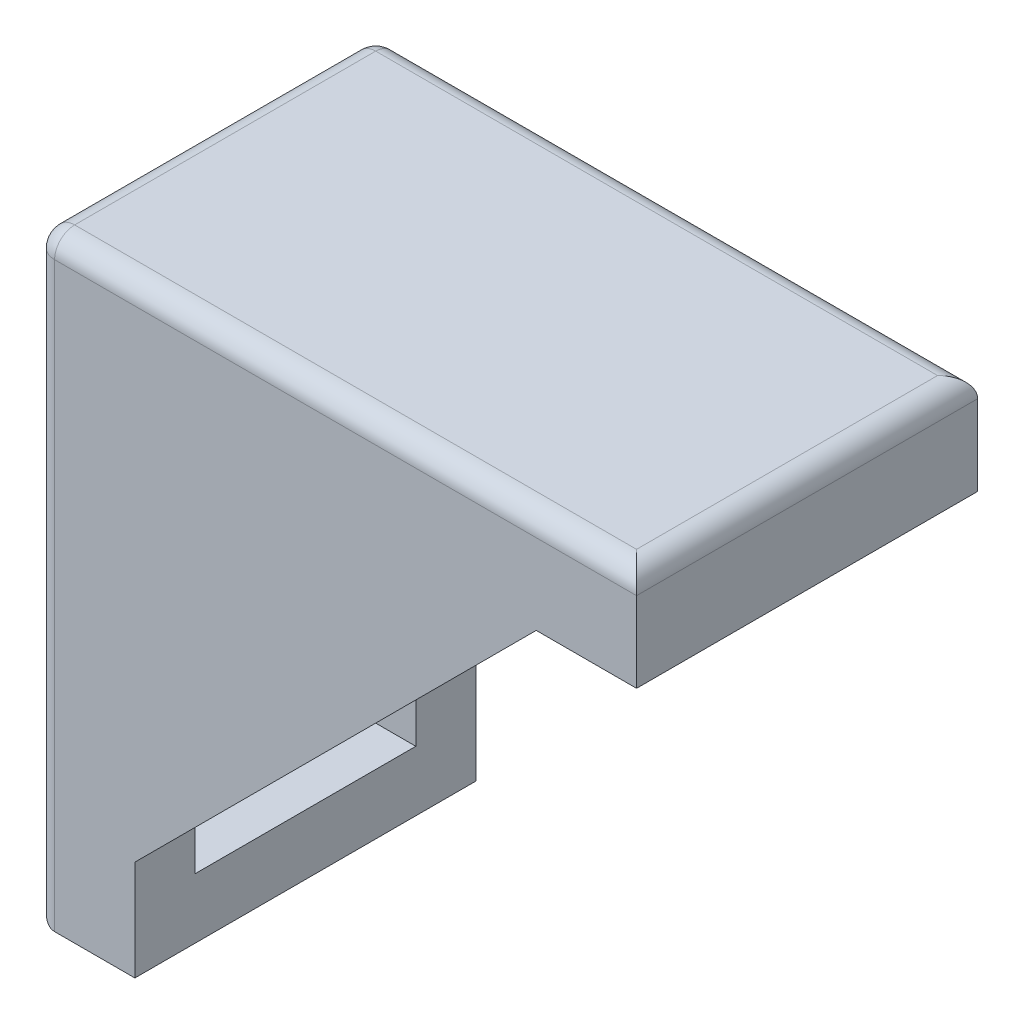
ISO-10303-21;
HEADER;
FILE_DESCRIPTION(('STEP AP214'),'2;1');
FILE_NAME('part.step','',(''),(''),'','','');
FILE_SCHEMA(('AUTOMOTIVE_DESIGN { 1 0 10303 214 1 1 1 1 }'));
ENDSEC;
DATA;
#1=APPLICATION_CONTEXT('core data for automotive mechanical design processes');
#2=APPLICATION_PROTOCOL_DEFINITION('international standard','automotive_design',2000,#1);
#3=PRODUCT_CONTEXT('',#1,'mechanical');
#4=PRODUCT('Part','Part','',(#3));
#5=PRODUCT_RELATED_PRODUCT_CATEGORY('part','',(#4));
#6=PRODUCT_DEFINITION_FORMATION('','',#4);
#7=PRODUCT_DEFINITION_CONTEXT('part definition',#1,'design');
#8=PRODUCT_DEFINITION('design','',#6,#7);
#9=PRODUCT_DEFINITION_SHAPE('','',#8);
#10=(LENGTH_UNIT() NAMED_UNIT(*) SI_UNIT(.MILLI.,.METRE.));
#11=(NAMED_UNIT(*) PLANE_ANGLE_UNIT() SI_UNIT($,.RADIAN.));
#12=(NAMED_UNIT(*) SI_UNIT($,.STERADIAN.) SOLID_ANGLE_UNIT());
#13=UNCERTAINTY_MEASURE_WITH_UNIT(LENGTH_MEASURE(1.E-05),#10,'distance_accuracy_value','');
#14=(GEOMETRIC_REPRESENTATION_CONTEXT(3) GLOBAL_UNCERTAINTY_ASSIGNED_CONTEXT((#13)) GLOBAL_UNIT_ASSIGNED_CONTEXT((#10,
#11,#12)) REPRESENTATION_CONTEXT('',''));
#15=CARTESIAN_POINT('',(0.,0.,0.));
#16=DIRECTION('',(0.,0.,1.));
#17=DIRECTION('',(1.,0.,0.));
#18=AXIS2_PLACEMENT_3D('',#15,#16,#17);
#19=CARTESIAN_POINT('',(30.,-5.,-17.));
#20=DIRECTION('',(0.,-1.,0.));
#21=DIRECTION('',(1.,0.,0.));
#22=AXIS2_PLACEMENT_3D('',#19,#20,#21);
#23=PLANE('',#22);
#24=DIRECTION('',(0.,0.,1.));
#25=VECTOR('',#24,1.);
#26=CARTESIAN_POINT('',(25.,-5.,-17.));
#27=LINE('',#26,#25);
#28=CARTESIAN_POINT('',(25.,-5.,-3.));
#29=VERTEX_POINT('',#28);
#30=CARTESIAN_POINT('',(25.,-5.,0.));
#31=VERTEX_POINT('',#30);
#32=EDGE_CURVE('E266',#29,#31,#27,.T.);
#33=ORIENTED_EDGE('',*,*,#32,.F.);
#34=DIRECTION('',(1.,0.,0.));
#35=VECTOR('',#34,1.);
#36=CARTESIAN_POINT('',(30.,-5.,-3.));
#37=LINE('',#36,#35);
#38=CARTESIAN_POINT('',(27.,-5.,-3.));
#39=VERTEX_POINT('',#38);
#40=EDGE_CURVE('E199',#29,#39,#37,.T.);
#41=ORIENTED_EDGE('',*,*,#40,.T.);
#42=DIRECTION('',(0.,0.,1.));
#43=VECTOR('',#42,1.);
#44=CARTESIAN_POINT('',(27.,-5.,-17.));
#45=LINE('',#44,#43);
#46=CARTESIAN_POINT('',(27.,-5.,-14.));
#47=VERTEX_POINT('',#46);
#48=EDGE_CURVE('E184',#47,#39,#45,.T.);
#49=ORIENTED_EDGE('',*,*,#48,.F.);
#50=DIRECTION('',(1.,0.,0.));
#51=VECTOR('',#50,1.);
#52=CARTESIAN_POINT('',(30.,-5.,-14.));
#53=LINE('',#52,#51);
#54=CARTESIAN_POINT('',(25.,-5.,-14.));
#55=VERTEX_POINT('',#54);
#56=EDGE_CURVE('E216',#55,#47,#53,.T.);
#57=ORIENTED_EDGE('',*,*,#56,.F.);
#58=CARTESIAN_POINT('',(25.,-5.,-17.));
#59=VERTEX_POINT('',#58);
#60=EDGE_CURVE('E262',#59,#55,#27,.T.);
#61=ORIENTED_EDGE('',*,*,#60,.F.);
#62=DIRECTION('',(1.,0.,0.));
#63=VECTOR('',#62,1.);
#64=CARTESIAN_POINT('',(30.,-5.,-17.));
#65=LINE('',#64,#63);
#66=CARTESIAN_POINT('',(30.,-5.,-17.));
#67=VERTEX_POINT('',#66);
#68=EDGE_CURVE('E232',#59,#67,#65,.T.);
#69=ORIENTED_EDGE('',*,*,#68,.T.);
#70=DIRECTION('',(0.,0.,1.));
#71=VECTOR('',#70,1.);
#72=CARTESIAN_POINT('',(30.,-5.,-17.));
#73=LINE('',#72,#71);
#74=CARTESIAN_POINT('',(30.,-5.,0.));
#75=VERTEX_POINT('',#74);
#76=EDGE_CURVE('E258',#67,#75,#73,.T.);
#77=ORIENTED_EDGE('',*,*,#76,.T.);
#78=DIRECTION('',(1.,0.,0.));
#79=VECTOR('',#78,1.);
#80=CARTESIAN_POINT('',(30.,-5.,0.));
#81=LINE('',#80,#79);
#82=EDGE_CURVE('E252',#31,#75,#81,.T.);
#83=ORIENTED_EDGE('',*,*,#82,.F.);
#84=EDGE_LOOP('',(#33,#41,#49,#57,#61,#69,#77,#83));
#85=FACE_BOUND('',#84,.T.);
#86=ADVANCED_FACE('F39',(#85),#23,.T.);
#87=CARTESIAN_POINT('',(25.,-5.,-17.));
#88=DIRECTION('',(0.707106781186547,-0.707106781186547,0.));
#89=DIRECTION('',(0.707106781186548,0.707106781186548,0.));
#90=AXIS2_PLACEMENT_3D('',#87,#88,#89);
#91=PLANE('',#90);
#92=DIRECTION('',(0.,0.,1.));
#93=VECTOR('',#92,1.);
#94=CARTESIAN_POINT('',(5.,-25.,-17.));
#95=LINE('',#94,#93);
#96=CARTESIAN_POINT('',(5.,-25.,-3.));
#97=VERTEX_POINT('',#96);
#98=CARTESIAN_POINT('',(5.,-25.,0.));
#99=VERTEX_POINT('',#98);
#100=EDGE_CURVE('E271',#97,#99,#95,.T.);
#101=ORIENTED_EDGE('',*,*,#100,.F.);
#102=DIRECTION('',(0.707106781186548,0.707106781186548,0.));
#103=VECTOR('',#102,1.);
#104=CARTESIAN_POINT('',(25.,-5.,-3.));
#105=LINE('',#104,#103);
#106=EDGE_CURVE('E192',#97,#29,#105,.T.);
#107=ORIENTED_EDGE('',*,*,#106,.T.);
#108=ORIENTED_EDGE('',*,*,#32,.T.);
#109=DIRECTION('',(0.707106781186548,0.707106781186548,0.));
#110=VECTOR('',#109,1.);
#111=CARTESIAN_POINT('',(25.,-5.,0.));
#112=LINE('',#111,#110);
#113=EDGE_CURVE('E248',#99,#31,#112,.T.);
#114=ORIENTED_EDGE('',*,*,#113,.F.);
#115=EDGE_LOOP('',(#101,#107,#108,#114));
#116=FACE_BOUND('',#115,.T.);
#117=ADVANCED_FACE('F418',(#116),#91,.T.);
#118=CARTESIAN_POINT('',(5.,-25.,-17.));
#119=DIRECTION('',(1.,0.,0.));
#120=DIRECTION('',(0.,1.,0.));
#121=AXIS2_PLACEMENT_3D('',#118,#119,#120);
#122=PLANE('',#121);
#123=DIRECTION('',(0.,0.,1.));
#124=VECTOR('',#123,1.);
#125=CARTESIAN_POINT('',(5.,-27.,-17.));
#126=LINE('',#125,#124);
#127=CARTESIAN_POINT('',(5.,-27.,-14.));
#128=VERTEX_POINT('',#127);
#129=CARTESIAN_POINT('',(5.,-27.,-3.));
#130=VERTEX_POINT('',#129);
#131=EDGE_CURVE('E57',#128,#130,#126,.T.);
#132=ORIENTED_EDGE('',*,*,#131,.T.);
#133=DIRECTION('',(0.,1.,0.));
#134=VECTOR('',#133,1.);
#135=CARTESIAN_POINT('',(5.,-25.,-3.));
#136=LINE('',#135,#134);
#137=EDGE_CURVE('E188',#130,#97,#136,.T.);
#138=ORIENTED_EDGE('',*,*,#137,.T.);
#139=ORIENTED_EDGE('',*,*,#100,.T.);
#140=DIRECTION('',(0.,1.,0.));
#141=VECTOR('',#140,1.);
#142=CARTESIAN_POINT('',(5.,-25.,0.));
#143=LINE('',#142,#141);
#144=CARTESIAN_POINT('',(5.,-30.,0.));
#145=VERTEX_POINT('',#144);
#146=EDGE_CURVE('E244',#145,#99,#143,.T.);
#147=ORIENTED_EDGE('',*,*,#146,.F.);
#148=DIRECTION('',(0.,0.,1.));
#149=VECTOR('',#148,1.);
#150=CARTESIAN_POINT('',(5.,-30.,-17.));
#151=LINE('',#150,#149);
#152=CARTESIAN_POINT('',(5.,-30.,-17.));
#153=VERTEX_POINT('',#152);
#154=EDGE_CURVE('E240',#153,#145,#151,.T.);
#155=ORIENTED_EDGE('',*,*,#154,.F.);
#156=DIRECTION('',(0.,1.,0.));
#157=VECTOR('',#156,1.);
#158=CARTESIAN_POINT('',(5.,-25.,-17.));
#159=LINE('',#158,#157);
#160=CARTESIAN_POINT('',(5.,-25.,-17.));
#161=VERTEX_POINT('',#160);
#162=EDGE_CURVE('E223',#153,#161,#159,.T.);
#163=ORIENTED_EDGE('',*,*,#162,.T.);
#164=CARTESIAN_POINT('',(5.,-25.,-14.));
#165=VERTEX_POINT('',#164);
#166=EDGE_CURVE('E267',#161,#165,#95,.T.);
#167=ORIENTED_EDGE('',*,*,#166,.T.);
#168=DIRECTION('',(0.,1.,0.));
#169=VECTOR('',#168,1.);
#170=CARTESIAN_POINT('',(5.,-25.,-14.));
#171=LINE('',#170,#169);
#172=EDGE_CURVE('E210',#128,#165,#171,.T.);
#173=ORIENTED_EDGE('',*,*,#172,.F.);
#174=EDGE_LOOP('',(#132,#138,#139,#147,#155,#163,#167,#173));
#175=FACE_BOUND('',#174,.T.);
#176=ADVANCED_FACE('F423',(#175),#122,.T.);
#177=CARTESIAN_POINT('',(0.,-30.,-17.));
#178=DIRECTION('',(-1.,0.,0.));
#179=DIRECTION('',(0.,0.,1.));
#180=AXIS2_PLACEMENT_3D('',#177,#178,#179);
#181=PLANE('',#180);
#182=DIRECTION('',(0.,-1.,0.));
#183=VECTOR('',#182,1.);
#184=CARTESIAN_POINT('',(0.,-30.,-16.));
#185=LINE('',#184,#183);
#186=CARTESIAN_POINT('',(0.,-1.,-16.));
#187=VERTEX_POINT('',#186);
#188=CARTESIAN_POINT('',(0.,-29.,-16.));
#189=VERTEX_POINT('',#188);
#190=EDGE_CURVE('E280',#187,#189,#185,.T.);
#191=ORIENTED_EDGE('',*,*,#190,.T.);
#192=DIRECTION('',(0.,0.,1.));
#193=VECTOR('',#192,1.);
#194=CARTESIAN_POINT('',(0.,-29.,-17.));
#195=LINE('',#194,#193);
#196=CARTESIAN_POINT('',(0.,-29.,-1.));
#197=VERTEX_POINT('',#196);
#198=EDGE_CURVE('E283',#189,#197,#195,.T.);
#199=ORIENTED_EDGE('',*,*,#198,.T.);
#200=DIRECTION('',(0.,-1.,0.));
#201=VECTOR('',#200,1.);
#202=CARTESIAN_POINT('',(0.,0.,-1.));
#203=LINE('',#202,#201);
#204=CARTESIAN_POINT('',(0.,-1.,-1.));
#205=VERTEX_POINT('',#204);
#206=EDGE_CURVE('E261',#197,#205,#203,.F.);
#207=ORIENTED_EDGE('',*,*,#206,.T.);
#208=DIRECTION('',(0.,0.,1.));
#209=VECTOR('',#208,1.);
#210=CARTESIAN_POINT('',(0.,-1.,-17.));
#211=LINE('',#210,#209);
#212=EDGE_CURVE('E277',#205,#187,#211,.F.);
#213=ORIENTED_EDGE('',*,*,#212,.T.);
#214=EDGE_LOOP('',(#191,#199,#207,#213));
#215=FACE_BOUND('',#214,.T.);
#216=ADVANCED_FACE('F398',(#215),#181,.T.);
#217=CARTESIAN_POINT('',(0.,0.,-17.));
#218=DIRECTION('',(0.,1.,0.));
#219=DIRECTION('',(0.,0.,1.));
#220=AXIS2_PLACEMENT_3D('',#217,#218,#219);
#221=PLANE('',#220);
#222=DIRECTION('',(-1.,0.,0.));
#223=VECTOR('',#222,1.);
#224=CARTESIAN_POINT('',(0.,0.,-16.));
#225=LINE('',#224,#223);
#226=CARTESIAN_POINT('',(29.,0.,-16.));
#227=VERTEX_POINT('',#226);
#228=CARTESIAN_POINT('',(1.,0.,-16.));
#229=VERTEX_POINT('',#228);
#230=EDGE_CURVE('E303',#227,#229,#225,.T.);
#231=ORIENTED_EDGE('',*,*,#230,.T.);
#232=DIRECTION('',(0.,0.,1.));
#233=VECTOR('',#232,1.);
#234=CARTESIAN_POINT('',(1.,0.,-17.));
#235=LINE('',#234,#233);
#236=CARTESIAN_POINT('',(1.,0.,-1.));
#237=VERTEX_POINT('',#236);
#238=EDGE_CURVE('E306',#229,#237,#235,.T.);
#239=ORIENTED_EDGE('',*,*,#238,.T.);
#240=DIRECTION('',(-1.,0.,0.));
#241=VECTOR('',#240,1.);
#242=CARTESIAN_POINT('',(30.,0.,-1.));
#243=LINE('',#242,#241);
#244=CARTESIAN_POINT('',(29.,0.,-1.));
#245=VERTEX_POINT('',#244);
#246=EDGE_CURVE('E297',#237,#245,#243,.F.);
#247=ORIENTED_EDGE('',*,*,#246,.T.);
#248=DIRECTION('',(0.,0.,1.));
#249=VECTOR('',#248,1.);
#250=CARTESIAN_POINT('',(29.,0.,-17.));
#251=LINE('',#250,#249);
#252=EDGE_CURVE('E300',#245,#227,#251,.F.);
#253=ORIENTED_EDGE('',*,*,#252,.T.);
#254=EDGE_LOOP('',(#231,#239,#247,#253));
#255=FACE_BOUND('',#254,.T.);
#256=ADVANCED_FACE('F439',(#255),#221,.T.);
#257=CARTESIAN_POINT('',(30.,0.,-17.));
#258=DIRECTION('',(1.,0.,0.));
#259=DIRECTION('',(0.,0.,-1.));
#260=AXIS2_PLACEMENT_3D('',#257,#258,#259);
#261=PLANE('',#260);
#262=DIRECTION('',(0.,1.,0.));
#263=VECTOR('',#262,1.);
#264=CARTESIAN_POINT('',(30.,0.,-17.));
#265=LINE('',#264,#263);
#266=CARTESIAN_POINT('',(30.,-1.,-17.));
#267=VERTEX_POINT('',#266);
#268=EDGE_CURVE('E236',#67,#267,#265,.T.);
#269=ORIENTED_EDGE('',*,*,#268,.T.);
#270=DIRECTION('',(0.,0.,1.));
#271=VECTOR('',#270,1.);
#272=CARTESIAN_POINT('',(30.,-1.,-17.));
#273=LINE('',#272,#271);
#274=CARTESIAN_POINT('',(30.,-1.,0.));
#275=VERTEX_POINT('',#274);
#276=EDGE_CURVE('E310',#267,#275,#273,.T.);
#277=ORIENTED_EDGE('',*,*,#276,.T.);
#278=DIRECTION('',(0.,1.,0.));
#279=VECTOR('',#278,1.);
#280=CARTESIAN_POINT('',(30.,0.,0.));
#281=LINE('',#280,#279);
#282=EDGE_CURVE('E224',#75,#275,#281,.T.);
#283=ORIENTED_EDGE('',*,*,#282,.F.);
#284=ORIENTED_EDGE('',*,*,#76,.F.);
#285=EDGE_LOOP('',(#269,#277,#283,#284));
#286=FACE_BOUND('',#285,.T.);
#287=ADVANCED_FACE('F363',(#286),#261,.T.);
#288=DIRECTION('',(0.707106781186548,0.707106781186548,0.));
#289=VECTOR('',#288,1.);
#290=CARTESIAN_POINT('',(25.,-5.,-14.));
#291=LINE('',#290,#289);
#292=EDGE_CURVE('E213',#165,#55,#291,.T.);
#293=ORIENTED_EDGE('',*,*,#292,.F.);
#294=ORIENTED_EDGE('',*,*,#166,.F.);
#295=DIRECTION('',(0.707106781186548,0.707106781186548,0.));
#296=VECTOR('',#295,1.);
#297=CARTESIAN_POINT('',(25.,-5.,-17.));
#298=LINE('',#297,#296);
#299=EDGE_CURVE('E228',#161,#59,#298,.T.);
#300=ORIENTED_EDGE('',*,*,#299,.T.);
#301=ORIENTED_EDGE('',*,*,#60,.T.);
#302=EDGE_LOOP('',(#293,#294,#300,#301));
#303=FACE_BOUND('',#302,.T.);
#304=ADVANCED_FACE('F426',(#303),#91,.T.);
#305=CARTESIAN_POINT('',(5.,-30.,-17.));
#306=DIRECTION('',(0.,-1.,0.));
#307=DIRECTION('',(0.,0.,-1.));
#308=AXIS2_PLACEMENT_3D('',#305,#306,#307);
#309=PLANE('',#308);
#310=DIRECTION('',(1.,0.,0.));
#311=VECTOR('',#310,1.);
#312=CARTESIAN_POINT('',(5.,-30.,0.));
#313=LINE('',#312,#311);
#314=CARTESIAN_POINT('',(1.,-30.,0.));
#315=VERTEX_POINT('',#314);
#316=EDGE_CURVE('E241',#315,#145,#313,.T.);
#317=ORIENTED_EDGE('',*,*,#316,.F.);
#318=DIRECTION('',(0.,0.,1.));
#319=VECTOR('',#318,1.);
#320=CARTESIAN_POINT('',(1.,-30.,-17.));
#321=LINE('',#320,#319);
#322=CARTESIAN_POINT('',(1.,-30.,-17.));
#323=VERTEX_POINT('',#322);
#324=EDGE_CURVE('E287',#315,#323,#321,.F.);
#325=ORIENTED_EDGE('',*,*,#324,.T.);
#326=DIRECTION('',(1.,0.,0.));
#327=VECTOR('',#326,1.);
#328=CARTESIAN_POINT('',(5.,-30.,-17.));
#329=LINE('',#328,#327);
#330=EDGE_CURVE('E220',#323,#153,#329,.T.);
#331=ORIENTED_EDGE('',*,*,#330,.T.);
#332=ORIENTED_EDGE('',*,*,#154,.T.);
#333=EDGE_LOOP('',(#317,#325,#331,#332));
#334=FACE_BOUND('',#333,.T.);
#335=ADVANCED_FACE('F386',(#334),#309,.T.);
#336=CARTESIAN_POINT('',(0.,0.,-17.));
#337=DIRECTION('',(0.,0.,-1.));
#338=DIRECTION('',(-1.,0.,0.));
#339=AXIS2_PLACEMENT_3D('',#336,#337,#338);
#340=PLANE('',#339);
#341=ORIENTED_EDGE('',*,*,#330,.F.);
#342=DIRECTION('',(0.,-1.,0.));
#343=VECTOR('',#342,1.);
#344=CARTESIAN_POINT('',(1.,0.,-17.));
#345=LINE('',#344,#343);
#346=CARTESIAN_POINT('',(1.,-1.,-17.));
#347=VERTEX_POINT('',#346);
#348=EDGE_CURVE('E294',#323,#347,#345,.F.);
#349=ORIENTED_EDGE('',*,*,#348,.T.);
#350=DIRECTION('',(-1.,0.,0.));
#351=VECTOR('',#350,1.);
#352=CARTESIAN_POINT('',(0.,-1.,-17.));
#353=LINE('',#352,#351);
#354=EDGE_CURVE('E291',#347,#267,#353,.F.);
#355=ORIENTED_EDGE('',*,*,#354,.T.);
#356=ORIENTED_EDGE('',*,*,#268,.F.);
#357=ORIENTED_EDGE('',*,*,#68,.F.);
#358=ORIENTED_EDGE('',*,*,#299,.F.);
#359=ORIENTED_EDGE('',*,*,#162,.F.);
#360=EDGE_LOOP('',(#341,#349,#355,#356,#357,#358,#359));
#361=FACE_BOUND('',#360,.T.);
#362=ADVANCED_FACE('F373',(#361),#340,.T.);
#363=CARTESIAN_POINT('',(0.,0.,0.));
#364=DIRECTION('',(0.,0.,-1.));
#365=DIRECTION('',(-1.,0.,0.));
#366=AXIS2_PLACEMENT_3D('',#363,#364,#365);
#367=PLANE('',#366);
#368=DIRECTION('',(-1.,0.,0.));
#369=VECTOR('',#368,1.);
#370=CARTESIAN_POINT('',(0.,-1.,0.));
#371=LINE('',#370,#369);
#372=CARTESIAN_POINT('',(1.,-1.,0.));
#373=VERTEX_POINT('',#372);
#374=EDGE_CURVE('E49',#275,#373,#371,.T.);
#375=ORIENTED_EDGE('',*,*,#374,.T.);
#376=DIRECTION('',(0.,-1.,0.));
#377=VECTOR('',#376,1.);
#378=CARTESIAN_POINT('',(1.,-30.,0.));
#379=LINE('',#378,#377);
#380=EDGE_CURVE('E11',#373,#315,#379,.T.);
#381=ORIENTED_EDGE('',*,*,#380,.T.);
#382=ORIENTED_EDGE('',*,*,#316,.T.);
#383=ORIENTED_EDGE('',*,*,#146,.T.);
#384=ORIENTED_EDGE('',*,*,#113,.T.);
#385=ORIENTED_EDGE('',*,*,#82,.T.);
#386=ORIENTED_EDGE('',*,*,#282,.T.);
#387=EDGE_LOOP('',(#375,#381,#382,#383,#384,#385,#386));
#388=FACE_BOUND('',#387,.T.);
#389=ADVANCED_FACE('F365',(#388),#367,.F.);
#390=CARTESIAN_POINT('',(29.,-1.,-17.));
#391=DIRECTION('',(0.,0.,1.));
#392=DIRECTION('',(1.,0.,0.));
#393=AXIS2_PLACEMENT_3D('',#390,#391,#392);
#394=CYLINDRICAL_SURFACE('',#393,1.);
#395=CARTESIAN_POINT('',(29.,-1.,-1.));
#396=DIRECTION('',(0.707106781186547,0.,-0.707106781186547));
#397=DIRECTION('',(0.707106781186547,0.,0.707106781186547));
#398=AXIS2_PLACEMENT_3D('',#395,#396,#397);
#399=ELLIPSE('',#398,1.41421356237309,1.);
#400=EDGE_CURVE('E344',#275,#245,#399,.F.);
#401=ORIENTED_EDGE('',*,*,#400,.F.);
#402=ORIENTED_EDGE('',*,*,#276,.F.);
#403=CARTESIAN_POINT('',(29.,-1.,-16.));
#404=DIRECTION('',(0.707106781186547,0.,0.707106781186547));
#405=DIRECTION('',(-0.707106781186547,0.,0.707106781186547));
#406=AXIS2_PLACEMENT_3D('',#403,#404,#405);
#407=ELLIPSE('',#406,1.41421356237309,1.);
#408=EDGE_CURVE('E43',#227,#267,#407,.F.);
#409=ORIENTED_EDGE('',*,*,#408,.F.);
#410=ORIENTED_EDGE('',*,*,#252,.F.);
#411=EDGE_LOOP('',(#401,#402,#409,#410));
#412=FACE_BOUND('',#411,.T.);
#413=ADVANCED_FACE('F41',(#412),#394,.T.);
#414=CARTESIAN_POINT('',(0.,-1.,-16.));
#415=DIRECTION('',(-1.,0.,0.));
#416=DIRECTION('',(0.,0.,1.));
#417=AXIS2_PLACEMENT_3D('',#414,#415,#416);
#418=CYLINDRICAL_SURFACE('',#417,1.);
#419=ORIENTED_EDGE('',*,*,#408,.T.);
#420=ORIENTED_EDGE('',*,*,#354,.F.);
#421=CARTESIAN_POINT('',(1.,-1.,-16.));
#422=DIRECTION('',(-1.,0.,0.));
#423=DIRECTION('',(0.,0.,1.));
#424=AXIS2_PLACEMENT_3D('',#421,#422,#423);
#425=CIRCLE('',#424,1.);
#426=EDGE_CURVE('E341',#229,#347,#425,.T.);
#427=ORIENTED_EDGE('',*,*,#426,.F.);
#428=ORIENTED_EDGE('',*,*,#230,.F.);
#429=EDGE_LOOP('',(#419,#420,#427,#428));
#430=FACE_BOUND('',#429,.T.);
#431=ADVANCED_FACE('F356',(#430),#418,.T.);
#432=CARTESIAN_POINT('',(1.,-1.,-17.));
#433=DIRECTION('',(0.,0.,1.));
#434=DIRECTION('',(1.,0.,0.));
#435=AXIS2_PLACEMENT_3D('',#432,#433,#434);
#436=CYLINDRICAL_SURFACE('',#435,1.);
#437=CARTESIAN_POINT('',(1.,-1.,-1.));
#438=DIRECTION('',(0.,0.,1.));
#439=DIRECTION('',(1.,0.,0.));
#440=AXIS2_PLACEMENT_3D('',#437,#438,#439);
#441=CIRCLE('',#440,1.);
#442=EDGE_CURVE('E333',#237,#205,#441,.T.);
#443=ORIENTED_EDGE('',*,*,#442,.F.);
#444=ORIENTED_EDGE('',*,*,#238,.F.);
#445=CARTESIAN_POINT('',(1.,-1.,-16.));
#446=DIRECTION('',(0.,0.,-1.));
#447=DIRECTION('',(-1.,0.,0.));
#448=AXIS2_PLACEMENT_3D('',#445,#446,#447);
#449=CIRCLE('',#448,1.);
#450=EDGE_CURVE('E337',#187,#229,#449,.T.);
#451=ORIENTED_EDGE('',*,*,#450,.F.);
#452=ORIENTED_EDGE('',*,*,#212,.F.);
#453=EDGE_LOOP('',(#443,#444,#451,#452));
#454=FACE_BOUND('',#453,.T.);
#455=ADVANCED_FACE('F403',(#454),#436,.T.);
#456=CARTESIAN_POINT('',(0.,-1.,-1.));
#457=DIRECTION('',(1.,0.,0.));
#458=DIRECTION('',(0.,0.,-1.));
#459=AXIS2_PLACEMENT_3D('',#456,#457,#458);
#460=CYLINDRICAL_SURFACE('',#459,1.);
#461=ORIENTED_EDGE('',*,*,#400,.T.);
#462=ORIENTED_EDGE('',*,*,#246,.F.);
#463=CARTESIAN_POINT('',(1.,-1.,-1.));
#464=DIRECTION('',(-1.,0.,0.));
#465=DIRECTION('',(0.,0.,1.));
#466=AXIS2_PLACEMENT_3D('',#463,#464,#465);
#467=CIRCLE('',#466,1.);
#468=EDGE_CURVE('E330',#373,#237,#467,.T.);
#469=ORIENTED_EDGE('',*,*,#468,.F.);
#470=ORIENTED_EDGE('',*,*,#374,.F.);
#471=EDGE_LOOP('',(#461,#462,#469,#470));
#472=FACE_BOUND('',#471,.T.);
#473=ADVANCED_FACE('F408',(#472),#460,.T.);
#474=CARTESIAN_POINT('',(1.,-1.,-16.));
#475=DIRECTION('',(0.,0.,1.));
#476=DIRECTION('',(1.,0.,0.));
#477=AXIS2_PLACEMENT_3D('',#474,#475,#476);
#478=SPHERICAL_SURFACE('',#477,1.);
#479=ORIENTED_EDGE('',*,*,#450,.T.);
#480=ORIENTED_EDGE('',*,*,#426,.T.);
#481=CARTESIAN_POINT('',(1.,-1.,-16.));
#482=DIRECTION('',(0.,1.,0.));
#483=DIRECTION('',(0.,0.,1.));
#484=AXIS2_PLACEMENT_3D('',#481,#482,#483);
#485=CIRCLE('',#484,1.);
#486=EDGE_CURVE('E326',#187,#347,#485,.F.);
#487=ORIENTED_EDGE('',*,*,#486,.F.);
#488=EDGE_LOOP('',(#479,#480,#487));
#489=FACE_BOUND('',#488,.T.);
#490=ADVANCED_FACE('F405',(#489),#478,.T.);
#491=CARTESIAN_POINT('',(1.,-1.,-1.));
#492=DIRECTION('',(0.,0.,1.));
#493=DIRECTION('',(1.,0.,0.));
#494=AXIS2_PLACEMENT_3D('',#491,#492,#493);
#495=SPHERICAL_SURFACE('',#494,1.);
#496=ORIENTED_EDGE('',*,*,#468,.T.);
#497=ORIENTED_EDGE('',*,*,#442,.T.);
#498=CARTESIAN_POINT('',(1.,-1.,-1.));
#499=DIRECTION('',(0.,1.,0.));
#500=DIRECTION('',(0.,0.,1.));
#501=AXIS2_PLACEMENT_3D('',#498,#499,#500);
#502=CIRCLE('',#501,1.);
#503=EDGE_CURVE('E322',#373,#205,#502,.F.);
#504=ORIENTED_EDGE('',*,*,#503,.F.);
#505=EDGE_LOOP('',(#496,#497,#504));
#506=FACE_BOUND('',#505,.T.);
#507=ADVANCED_FACE('F407',(#506),#495,.T.);
#508=CARTESIAN_POINT('',(1.,-30.,-16.));
#509=DIRECTION('',(0.,-1.,0.));
#510=DIRECTION('',(0.,0.,-1.));
#511=AXIS2_PLACEMENT_3D('',#508,#509,#510);
#512=CYLINDRICAL_SURFACE('',#511,1.);
#513=ORIENTED_EDGE('',*,*,#486,.T.);
#514=ORIENTED_EDGE('',*,*,#348,.F.);
#515=CARTESIAN_POINT('',(1.,-29.,-16.));
#516=DIRECTION('',(0.,-0.707106781186547,0.707106781186547));
#517=DIRECTION('',(0.,-0.707106781186547,-0.707106781186547));
#518=AXIS2_PLACEMENT_3D('',#515,#516,#517);
#519=ELLIPSE('',#518,1.41421356237309,1.);
#520=EDGE_CURVE('E318',#189,#323,#519,.T.);
#521=ORIENTED_EDGE('',*,*,#520,.F.);
#522=ORIENTED_EDGE('',*,*,#190,.F.);
#523=EDGE_LOOP('',(#513,#514,#521,#522));
#524=FACE_BOUND('',#523,.T.);
#525=ADVANCED_FACE('F379',(#524),#512,.T.);
#526=CARTESIAN_POINT('',(1.,0.,-1.));
#527=DIRECTION('',(0.,1.,0.));
#528=DIRECTION('',(0.,0.,1.));
#529=AXIS2_PLACEMENT_3D('',#526,#527,#528);
#530=CYLINDRICAL_SURFACE('',#529,1.);
#531=ORIENTED_EDGE('',*,*,#503,.T.);
#532=ORIENTED_EDGE('',*,*,#206,.F.);
#533=CARTESIAN_POINT('',(1.,-29.,-1.));
#534=DIRECTION('',(0.,0.707106781186547,0.707106781186547));
#535=DIRECTION('',(0.,0.707106781186547,-0.707106781186547));
#536=AXIS2_PLACEMENT_3D('',#533,#534,#535);
#537=ELLIPSE('',#536,1.41421356237309,1.);
#538=EDGE_CURVE('E315',#315,#197,#537,.F.);
#539=ORIENTED_EDGE('',*,*,#538,.F.);
#540=ORIENTED_EDGE('',*,*,#380,.F.);
#541=EDGE_LOOP('',(#531,#532,#539,#540));
#542=FACE_BOUND('',#541,.T.);
#543=ADVANCED_FACE('F394',(#542),#530,.T.);
#544=CARTESIAN_POINT('',(1.,-29.,-17.));
#545=DIRECTION('',(0.,0.,1.));
#546=DIRECTION('',(1.,0.,0.));
#547=AXIS2_PLACEMENT_3D('',#544,#545,#546);
#548=CYLINDRICAL_SURFACE('',#547,1.);
#549=ORIENTED_EDGE('',*,*,#520,.T.);
#550=ORIENTED_EDGE('',*,*,#324,.F.);
#551=ORIENTED_EDGE('',*,*,#538,.T.);
#552=ORIENTED_EDGE('',*,*,#198,.F.);
#553=EDGE_LOOP('',(#549,#550,#551,#552));
#554=FACE_BOUND('',#553,.T.);
#555=ADVANCED_FACE('F390',(#554),#548,.T.);
#556=CARTESIAN_POINT('',(3.,-30.,-17.));
#557=DIRECTION('',(-1.,0.,0.));
#558=DIRECTION('',(0.,0.,1.));
#559=AXIS2_PLACEMENT_3D('',#556,#557,#558);
#560=PLANE('',#559);
#561=DIRECTION('',(0.,1.,0.));
#562=VECTOR('',#561,1.);
#563=CARTESIAN_POINT('',(3.,0.,-14.));
#564=LINE('',#563,#562);
#565=CARTESIAN_POINT('',(3.,-27.,-14.));
#566=VERTEX_POINT('',#565);
#567=CARTESIAN_POINT('',(3.,-3.,-14.));
#568=VERTEX_POINT('',#567);
#569=EDGE_CURVE('E623',#566,#568,#564,.T.);
#570=ORIENTED_EDGE('',*,*,#569,.T.);
#571=DIRECTION('',(0.,0.,1.));
#572=VECTOR('',#571,1.);
#573=CARTESIAN_POINT('',(3.,-3.,-17.));
#574=LINE('',#573,#572);
#575=CARTESIAN_POINT('',(3.,-3.,-3.));
#576=VERTEX_POINT('',#575);
#577=EDGE_CURVE('E181',#568,#576,#574,.T.);
#578=ORIENTED_EDGE('',*,*,#577,.T.);
#579=DIRECTION('',(0.,1.,0.));
#580=VECTOR('',#579,1.);
#581=CARTESIAN_POINT('',(3.,0.,-3.));
#582=LINE('',#581,#580);
#583=CARTESIAN_POINT('',(3.,-27.,-3.));
#584=VERTEX_POINT('',#583);
#585=EDGE_CURVE('E176',#584,#576,#582,.T.);
#586=ORIENTED_EDGE('',*,*,#585,.F.);
#587=DIRECTION('',(0.,0.,-1.));
#588=VECTOR('',#587,1.);
#589=CARTESIAN_POINT('',(3.,-27.,-17.));
#590=LINE('',#589,#588);
#591=EDGE_CURVE('E164',#584,#566,#590,.T.);
#592=ORIENTED_EDGE('',*,*,#591,.T.);
#593=EDGE_LOOP('',(#570,#578,#586,#592));
#594=FACE_BOUND('',#593,.T.);
#595=ADVANCED_FACE('F180',(#594),#560,.F.);
#596=CARTESIAN_POINT('',(0.,-3.,-17.));
#597=DIRECTION('',(0.,1.,0.));
#598=DIRECTION('',(0.,0.,1.));
#599=AXIS2_PLACEMENT_3D('',#596,#597,#598);
#600=PLANE('',#599);
#601=DIRECTION('',(1.,0.,0.));
#602=VECTOR('',#601,1.);
#603=CARTESIAN_POINT('',(0.,-3.,-14.));
#604=LINE('',#603,#602);
#605=CARTESIAN_POINT('',(27.,-3.,-14.));
#606=VERTEX_POINT('',#605);
#607=EDGE_CURVE('E175',#568,#606,#604,.T.);
#608=ORIENTED_EDGE('',*,*,#607,.T.);
#609=DIRECTION('',(0.,0.,1.));
#610=VECTOR('',#609,1.);
#611=CARTESIAN_POINT('',(27.,-3.,-17.));
#612=LINE('',#611,#610);
#613=CARTESIAN_POINT('',(27.,-3.,-3.));
#614=VERTEX_POINT('',#613);
#615=EDGE_CURVE('E319',#606,#614,#612,.T.);
#616=ORIENTED_EDGE('',*,*,#615,.T.);
#617=DIRECTION('',(1.,0.,0.));
#618=VECTOR('',#617,1.);
#619=CARTESIAN_POINT('',(0.,-3.,-3.));
#620=LINE('',#619,#618);
#621=EDGE_CURVE('E630',#576,#614,#620,.T.);
#622=ORIENTED_EDGE('',*,*,#621,.F.);
#623=ORIENTED_EDGE('',*,*,#577,.F.);
#624=EDGE_LOOP('',(#608,#616,#622,#623));
#625=FACE_BOUND('',#624,.T.);
#626=ADVANCED_FACE('F463',(#625),#600,.F.);
#627=CARTESIAN_POINT('',(27.,0.,-17.));
#628=DIRECTION('',(1.,0.,0.));
#629=DIRECTION('',(0.,0.,-1.));
#630=AXIS2_PLACEMENT_3D('',#627,#628,#629);
#631=PLANE('',#630);
#632=DIRECTION('',(0.,1.,0.));
#633=VECTOR('',#632,1.);
#634=CARTESIAN_POINT('',(27.,0.,-14.));
#635=LINE('',#634,#633);
#636=EDGE_CURVE('E209',#47,#606,#635,.T.);
#637=ORIENTED_EDGE('',*,*,#636,.F.);
#638=ORIENTED_EDGE('',*,*,#48,.T.);
#639=DIRECTION('',(0.,1.,0.));
#640=VECTOR('',#639,1.);
#641=CARTESIAN_POINT('',(27.,0.,-3.));
#642=LINE('',#641,#640);
#643=EDGE_CURVE('E203',#39,#614,#642,.T.);
#644=ORIENTED_EDGE('',*,*,#643,.T.);
#645=ORIENTED_EDGE('',*,*,#615,.F.);
#646=EDGE_LOOP('',(#637,#638,#644,#645));
#647=FACE_BOUND('',#646,.T.);
#648=ADVANCED_FACE('F471',(#647),#631,.F.);
#649=CARTESIAN_POINT('',(5.,-27.,-17.));
#650=DIRECTION('',(0.,-1.,0.));
#651=DIRECTION('',(0.,0.,-1.));
#652=AXIS2_PLACEMENT_3D('',#649,#650,#651);
#653=PLANE('',#652);
#654=DIRECTION('',(1.,0.,0.));
#655=VECTOR('',#654,1.);
#656=CARTESIAN_POINT('',(5.,-27.,-3.));
#657=LINE('',#656,#655);
#658=EDGE_CURVE('E168',#584,#130,#657,.T.);
#659=ORIENTED_EDGE('',*,*,#658,.T.);
#660=ORIENTED_EDGE('',*,*,#131,.F.);
#661=DIRECTION('',(1.,0.,0.));
#662=VECTOR('',#661,1.);
#663=CARTESIAN_POINT('',(5.,-27.,-14.));
#664=LINE('',#663,#662);
#665=EDGE_CURVE('E170',#566,#128,#664,.T.);
#666=ORIENTED_EDGE('',*,*,#665,.F.);
#667=ORIENTED_EDGE('',*,*,#591,.F.);
#668=EDGE_LOOP('',(#659,#660,#666,#667));
#669=FACE_BOUND('',#668,.T.);
#670=ADVANCED_FACE('F166',(#669),#653,.F.);
#671=CARTESIAN_POINT('',(0.,0.,-14.));
#672=DIRECTION('',(0.,0.,-1.));
#673=DIRECTION('',(-1.,0.,0.));
#674=AXIS2_PLACEMENT_3D('',#671,#672,#673);
#675=PLANE('',#674);
#676=ORIENTED_EDGE('',*,*,#665,.T.);
#677=ORIENTED_EDGE('',*,*,#172,.T.);
#678=ORIENTED_EDGE('',*,*,#292,.T.);
#679=ORIENTED_EDGE('',*,*,#56,.T.);
#680=ORIENTED_EDGE('',*,*,#636,.T.);
#681=ORIENTED_EDGE('',*,*,#607,.F.);
#682=ORIENTED_EDGE('',*,*,#569,.F.);
#683=EDGE_LOOP('',(#676,#677,#678,#679,#680,#681,#682));
#684=FACE_BOUND('',#683,.T.);
#685=ADVANCED_FACE('F486',(#684),#675,.F.);
#686=CARTESIAN_POINT('',(0.,0.,-3.));
#687=DIRECTION('',(0.,0.,-1.));
#688=DIRECTION('',(-1.,0.,0.));
#689=AXIS2_PLACEMENT_3D('',#686,#687,#688);
#690=PLANE('',#689);
#691=ORIENTED_EDGE('',*,*,#621,.T.);
#692=ORIENTED_EDGE('',*,*,#643,.F.);
#693=ORIENTED_EDGE('',*,*,#40,.F.);
#694=ORIENTED_EDGE('',*,*,#106,.F.);
#695=ORIENTED_EDGE('',*,*,#137,.F.);
#696=ORIENTED_EDGE('',*,*,#658,.F.);
#697=ORIENTED_EDGE('',*,*,#585,.T.);
#698=EDGE_LOOP('',(#691,#692,#693,#694,#695,#696,#697));
#699=FACE_BOUND('',#698,.T.);
#700=ADVANCED_FACE('F186',(#699),#690,.T.);
#701=CLOSED_SHELL('',(#86,#117,#176,#216,#256,#287,#304,#335,#362,#389,#413,#431,#455,#473,#490,
#507,#525,#543,#555,#595,#626,#648,#670,#685,#700));
#702=MANIFOLD_SOLID_BREP('B2',#701);
#703=ADVANCED_BREP_SHAPE_REPRESENTATION('',(#18,#702),#14);
#704=SHAPE_DEFINITION_REPRESENTATION(#9,#703);
ENDSEC;
END-ISO-10303-21;
